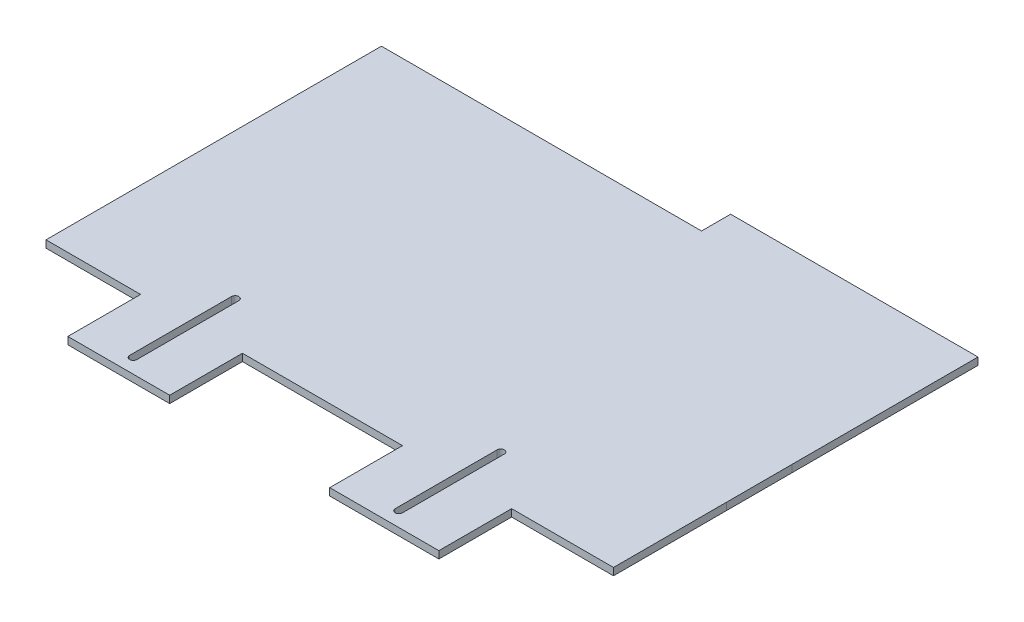
ISO-10303-21;
HEADER;
FILE_DESCRIPTION(('STEP AP214'),'2;1');
FILE_NAME('part.step','',(''),(''),'','','');
FILE_SCHEMA(('AUTOMOTIVE_DESIGN { 1 0 10303 214 1 1 1 1 }'));
ENDSEC;
DATA;
#1=APPLICATION_CONTEXT('core data for automotive mechanical design processes');
#2=APPLICATION_PROTOCOL_DEFINITION('international standard','automotive_design',2000,#1);
#3=PRODUCT_CONTEXT('',#1,'mechanical');
#4=PRODUCT('Part','Part','',(#3));
#5=PRODUCT_RELATED_PRODUCT_CATEGORY('part','',(#4));
#6=PRODUCT_DEFINITION_FORMATION('','',#4);
#7=PRODUCT_DEFINITION_CONTEXT('part definition',#1,'design');
#8=PRODUCT_DEFINITION('design','',#6,#7);
#9=PRODUCT_DEFINITION_SHAPE('','',#8);
#10=(LENGTH_UNIT() NAMED_UNIT(*) SI_UNIT(.MILLI.,.METRE.));
#11=(NAMED_UNIT(*) PLANE_ANGLE_UNIT() SI_UNIT($,.RADIAN.));
#12=(NAMED_UNIT(*) SI_UNIT($,.STERADIAN.) SOLID_ANGLE_UNIT());
#13=UNCERTAINTY_MEASURE_WITH_UNIT(LENGTH_MEASURE(1.E-05),#10,'distance_accuracy_value','');
#14=(GEOMETRIC_REPRESENTATION_CONTEXT(3) GLOBAL_UNCERTAINTY_ASSIGNED_CONTEXT((#13)) GLOBAL_UNIT_ASSIGNED_CONTEXT((#10,
#11,#12)) REPRESENTATION_CONTEXT('',''));
#15=CARTESIAN_POINT('',(0.,0.,0.));
#16=DIRECTION('',(0.,0.,1.));
#17=DIRECTION('',(1.,0.,0.));
#18=AXIS2_PLACEMENT_3D('',#15,#16,#17);
#19=CARTESIAN_POINT('',(-247.662974969548,3.175,190.824999985));
#20=DIRECTION('',(0.,0.,-1.));
#21=DIRECTION('',(-1.,0.,0.));
#22=AXIS2_PLACEMENT_3D('',#19,#20,#21);
#23=PLANE('',#22);
#24=DIRECTION('',(1.,0.,0.));
#25=VECTOR('',#24,1.);
#26=CARTESIAN_POINT('',(-247.662974969548,-3.175,190.824999985));
#27=LINE('',#26,#25);
#28=CARTESIAN_POINT('',(63.4870250304521,-3.175,190.824999985));
#29=VERTEX_POINT('',#28);
#30=CARTESIAN_POINT('',(158.737025030452,-3.175,190.824999985));
#31=VERTEX_POINT('',#30);
#32=EDGE_CURVE('E446',#29,#31,#27,.T.);
#33=ORIENTED_EDGE('',*,*,#32,.T.);
#34=DIRECTION('',(0.,1.,0.));
#35=VECTOR('',#34,1.);
#36=CARTESIAN_POINT('',(158.737025030452,-3.175,190.824999985));
#37=LINE('',#36,#35);
#38=CARTESIAN_POINT('',(158.737025030452,3.175,190.824999985));
#39=VERTEX_POINT('',#38);
#40=EDGE_CURVE('E353',#31,#39,#37,.T.);
#41=ORIENTED_EDGE('',*,*,#40,.T.);
#42=DIRECTION('',(1.,0.,0.));
#43=VECTOR('',#42,1.);
#44=CARTESIAN_POINT('',(-247.662974969548,3.175,190.824999985));
#45=LINE('',#44,#43);
#46=CARTESIAN_POINT('',(63.4870250304521,3.175,190.824999985));
#47=VERTEX_POINT('',#46);
#48=EDGE_CURVE('E433',#47,#39,#45,.T.);
#49=ORIENTED_EDGE('',*,*,#48,.F.);
#50=DIRECTION('',(0.,1.,0.));
#51=VECTOR('',#50,1.);
#52=CARTESIAN_POINT('',(63.4870250304521,-3.175,190.824999985));
#53=LINE('',#52,#51);
#54=EDGE_CURVE('E350',#29,#47,#53,.T.);
#55=ORIENTED_EDGE('',*,*,#54,.F.);
#56=EDGE_LOOP('',(#33,#41,#49,#55));
#57=FACE_BOUND('',#56,.T.);
#58=ADVANCED_FACE('F41',(#57),#23,.F.);
#59=CARTESIAN_POINT('',(0.,3.175,28.575));
#60=DIRECTION('',(0.,0.,-1.));
#61=DIRECTION('',(-1.,0.,0.));
#62=AXIS2_PLACEMENT_3D('',#59,#60,#61);
#63=PLANE('',#62);
#64=DIRECTION('',(0.,1.,0.));
#65=VECTOR('',#64,1.);
#66=CARTESIAN_POINT('',(247.637025030452,3.175,28.575));
#67=LINE('',#66,#65);
#68=CARTESIAN_POINT('',(247.637025030452,-3.175,28.575));
#69=VERTEX_POINT('',#68);
#70=CARTESIAN_POINT('',(247.637025030452,3.175,28.575));
#71=VERTEX_POINT('',#70);
#72=EDGE_CURVE('E459',#69,#71,#67,.T.);
#73=ORIENTED_EDGE('',*,*,#72,.F.);
#74=DIRECTION('',(1.,0.,0.));
#75=VECTOR('',#74,1.);
#76=CARTESIAN_POINT('',(0.,-3.175,28.575));
#77=LINE('',#76,#75);
#78=CARTESIAN_POINT('',(247.65,-3.175,28.575));
#79=VERTEX_POINT('',#78);
#80=EDGE_CURVE('E463',#69,#79,#77,.T.);
#81=ORIENTED_EDGE('',*,*,#80,.T.);
#82=DIRECTION('',(0.,-1.,0.));
#83=VECTOR('',#82,1.);
#84=CARTESIAN_POINT('',(247.65,3.175,28.575));
#85=LINE('',#84,#83);
#86=CARTESIAN_POINT('',(247.65,3.175,28.575));
#87=VERTEX_POINT('',#86);
#88=EDGE_CURVE('E11',#87,#79,#85,.T.);
#89=ORIENTED_EDGE('',*,*,#88,.F.);
#90=DIRECTION('',(1.,0.,0.));
#91=VECTOR('',#90,1.);
#92=CARTESIAN_POINT('',(0.,3.175,28.575));
#93=LINE('',#92,#91);
#94=EDGE_CURVE('E464',#71,#87,#93,.T.);
#95=ORIENTED_EDGE('',*,*,#94,.F.);
#96=EDGE_LOOP('',(#73,#81,#89,#95));
#97=FACE_BOUND('',#96,.T.);
#98=ADVANCED_FACE('F43',(#97),#63,.F.);
#99=CARTESIAN_POINT('',(0.,3.175,-28.575));
#100=DIRECTION('',(0.,0.,-1.));
#101=DIRECTION('',(-1.,0.,0.));
#102=AXIS2_PLACEMENT_3D('',#99,#100,#101);
#103=PLANE('',#102);
#104=DIRECTION('',(1.,0.,0.));
#105=VECTOR('',#104,1.);
#106=CARTESIAN_POINT('',(0.,-3.175,-28.575));
#107=LINE('',#106,#105);
#108=CARTESIAN_POINT('',(247.637025030452,-3.175,-28.575));
#109=VERTEX_POINT('',#108);
#110=CARTESIAN_POINT('',(247.65,-3.175,-28.575));
#111=VERTEX_POINT('',#110);
#112=EDGE_CURVE('E468',#109,#111,#107,.T.);
#113=ORIENTED_EDGE('',*,*,#112,.F.);
#114=DIRECTION('',(0.,1.,0.));
#115=VECTOR('',#114,1.);
#116=CARTESIAN_POINT('',(247.637025030452,3.175,-28.575));
#117=LINE('',#116,#115);
#118=CARTESIAN_POINT('',(247.637025030452,3.175,-28.575));
#119=VERTEX_POINT('',#118);
#120=EDGE_CURVE('E455',#109,#119,#117,.T.);
#121=ORIENTED_EDGE('',*,*,#120,.T.);
#122=DIRECTION('',(1.,0.,0.));
#123=VECTOR('',#122,1.);
#124=CARTESIAN_POINT('',(0.,3.175,-28.575));
#125=LINE('',#124,#123);
#126=CARTESIAN_POINT('',(247.65,3.175,-28.575));
#127=VERTEX_POINT('',#126);
#128=EDGE_CURVE('E472',#119,#127,#125,.T.);
#129=ORIENTED_EDGE('',*,*,#128,.T.);
#130=DIRECTION('',(0.,-1.,0.));
#131=VECTOR('',#130,1.);
#132=CARTESIAN_POINT('',(247.65,3.175,-28.575));
#133=LINE('',#132,#131);
#134=EDGE_CURVE('E50',#127,#111,#133,.T.);
#135=ORIENTED_EDGE('',*,*,#134,.T.);
#136=EDGE_LOOP('',(#113,#121,#129,#135));
#137=FACE_BOUND('',#136,.T.);
#138=ADVANCED_FACE('F487',(#137),#103,.T.);
#139=CARTESIAN_POINT('',(247.65,3.175,0.));
#140=DIRECTION('',(-1.,0.,0.));
#141=DIRECTION('',(0.,0.,1.));
#142=AXIS2_PLACEMENT_3D('',#139,#140,#141);
#143=PLANE('',#142);
#144=DIRECTION('',(0.,0.,-1.));
#145=VECTOR('',#144,1.);
#146=CARTESIAN_POINT('',(247.65,-3.175,0.));
#147=LINE('',#146,#145);
#148=EDGE_CURVE('E477',#79,#111,#147,.T.);
#149=ORIENTED_EDGE('',*,*,#148,.T.);
#150=ORIENTED_EDGE('',*,*,#134,.F.);
#151=DIRECTION('',(0.,0.,-1.));
#152=VECTOR('',#151,1.);
#153=CARTESIAN_POINT('',(247.65,3.175,0.));
#154=LINE('',#153,#152);
#155=EDGE_CURVE('E467',#87,#127,#154,.T.);
#156=ORIENTED_EDGE('',*,*,#155,.F.);
#157=ORIENTED_EDGE('',*,*,#88,.T.);
#158=EDGE_LOOP('',(#149,#150,#156,#157));
#159=FACE_BOUND('',#158,.T.);
#160=ADVANCED_FACE('F492',(#159),#143,.F.);
#161=CARTESIAN_POINT('',(0.,3.175,0.));
#162=DIRECTION('',(0.,1.,0.));
#163=DIRECTION('',(0.,0.,1.));
#164=AXIS2_PLACEMENT_3D('',#161,#162,#163);
#165=PLANE('',#164);
#166=DIRECTION('',(0.,0.,-1.));
#167=VECTOR('',#166,1.);
#168=CARTESIAN_POINT('',(31.7370250304521,3.175,-165.424999985));
#169=LINE('',#168,#167);
#170=CARTESIAN_POINT('',(31.7370250304521,3.175,-165.424999985));
#171=VERTEX_POINT('',#170);
#172=CARTESIAN_POINT('',(31.7370250304521,3.175,-190.824999985));
#173=VERTEX_POINT('',#172);
#174=EDGE_CURVE('E238',#171,#173,#169,.T.);
#175=ORIENTED_EDGE('',*,*,#174,.F.);
#176=DIRECTION('',(1.,0.,0.));
#177=VECTOR('',#176,1.);
#178=CARTESIAN_POINT('',(31.7370250304521,3.175,-165.424999985));
#179=LINE('',#178,#177);
#180=CARTESIAN_POINT('',(-247.662974969548,3.175,-165.424999985));
#181=VERTEX_POINT('',#180);
#182=EDGE_CURVE('E217',#181,#171,#179,.T.);
#183=ORIENTED_EDGE('',*,*,#182,.F.);
#184=DIRECTION('',(0.,0.,1.));
#185=VECTOR('',#184,1.);
#186=CARTESIAN_POINT('',(-247.662974969548,3.175,190.824999985));
#187=LINE('',#186,#185);
#188=CARTESIAN_POINT('',(-247.662974969548,3.175,127.324999985));
#189=VERTEX_POINT('',#188);
#190=EDGE_CURVE('E430',#181,#189,#187,.T.);
#191=ORIENTED_EDGE('',*,*,#190,.T.);
#192=DIRECTION('',(-1.,0.,0.));
#193=VECTOR('',#192,1.);
#194=CARTESIAN_POINT('',(-165.112974969548,3.175,127.324999985));
#195=LINE('',#194,#193);
#196=CARTESIAN_POINT('',(-165.112974969548,3.175,127.324999985));
#197=VERTEX_POINT('',#196);
#198=EDGE_CURVE('E404',#197,#189,#195,.T.);
#199=ORIENTED_EDGE('',*,*,#198,.F.);
#200=DIRECTION('',(0.,0.,-1.));
#201=VECTOR('',#200,1.);
#202=CARTESIAN_POINT('',(-165.112974969548,3.175,127.324999985));
#203=LINE('',#202,#201);
#204=CARTESIAN_POINT('',(-165.112974969548,3.175,190.824999985));
#205=VERTEX_POINT('',#204);
#206=EDGE_CURVE('E285',#205,#197,#203,.T.);
#207=ORIENTED_EDGE('',*,*,#206,.F.);
#208=CARTESIAN_POINT('',(-76.2129749695479,3.175,190.824999985));
#209=VERTEX_POINT('',#208);
#210=EDGE_CURVE('E437',#205,#209,#45,.T.);
#211=ORIENTED_EDGE('',*,*,#210,.T.);
#212=DIRECTION('',(0.,0.,1.));
#213=VECTOR('',#212,1.);
#214=CARTESIAN_POINT('',(-76.2129749695479,3.175,190.824999985));
#215=LINE('',#214,#213);
#216=CARTESIAN_POINT('',(-76.2129749695479,3.175,127.324999985));
#217=VERTEX_POINT('',#216);
#218=EDGE_CURVE('E368',#217,#209,#215,.T.);
#219=ORIENTED_EDGE('',*,*,#218,.F.);
#220=DIRECTION('',(-1.,0.,0.));
#221=VECTOR('',#220,1.);
#222=CARTESIAN_POINT('',(-76.2129749695479,3.175,127.324999985));
#223=LINE('',#222,#221);
#224=CARTESIAN_POINT('',(63.4870250304521,3.175,127.324999985));
#225=VERTEX_POINT('',#224);
#226=EDGE_CURVE('E381',#225,#217,#223,.T.);
#227=ORIENTED_EDGE('',*,*,#226,.F.);
#228=DIRECTION('',(0.,0.,-1.));
#229=VECTOR('',#228,1.);
#230=CARTESIAN_POINT('',(63.4870250304521,3.175,190.824999985));
#231=LINE('',#230,#229);
#232=EDGE_CURVE('E377',#47,#225,#231,.T.);
#233=ORIENTED_EDGE('',*,*,#232,.F.);
#234=ORIENTED_EDGE('',*,*,#48,.T.);
#235=DIRECTION('',(0.,0.,1.));
#236=VECTOR('',#235,1.);
#237=CARTESIAN_POINT('',(158.737025030452,3.175,127.324999985));
#238=LINE('',#237,#236);
#239=CARTESIAN_POINT('',(158.737025030452,3.175,127.324999985));
#240=VERTEX_POINT('',#239);
#241=EDGE_CURVE('E341',#240,#39,#238,.T.);
#242=ORIENTED_EDGE('',*,*,#241,.F.);
#243=DIRECTION('',(-1.,0.,0.));
#244=VECTOR('',#243,1.);
#245=CARTESIAN_POINT('',(158.737025030452,3.175,127.324999985));
#246=LINE('',#245,#244);
#247=CARTESIAN_POINT('',(247.637025030452,3.175,127.324999985));
#248=VERTEX_POINT('',#247);
#249=EDGE_CURVE('E346',#248,#240,#246,.T.);
#250=ORIENTED_EDGE('',*,*,#249,.F.);
#251=DIRECTION('',(0.,0.,-1.));
#252=VECTOR('',#251,1.);
#253=CARTESIAN_POINT('',(247.637025030452,3.175,190.824999985));
#254=LINE('',#253,#252);
#255=EDGE_CURVE('E422',#248,#71,#254,.T.);
#256=ORIENTED_EDGE('',*,*,#255,.T.);
#257=ORIENTED_EDGE('',*,*,#94,.T.);
#258=ORIENTED_EDGE('',*,*,#155,.T.);
#259=ORIENTED_EDGE('',*,*,#128,.F.);
#260=CARTESIAN_POINT('',(247.637025030452,3.175,-190.824999985));
#261=VERTEX_POINT('',#260);
#262=EDGE_CURVE('E426',#119,#261,#254,.T.);
#263=ORIENTED_EDGE('',*,*,#262,.T.);
#264=DIRECTION('',(-1.,0.,0.));
#265=VECTOR('',#264,1.);
#266=CARTESIAN_POINT('',(-247.662974969548,3.175,-190.824999985));
#267=LINE('',#266,#265);
#268=EDGE_CURVE('E425',#261,#173,#267,.T.);
#269=ORIENTED_EDGE('',*,*,#268,.T.);
#270=EDGE_LOOP('',(#175,#183,#191,#199,#207,#211,#219,#227,#233,#234,#242,#250,#256,#257,#258,
#259,#263,#269));
#271=FACE_BOUND('',#270,.T.);
#272=CARTESIAN_POINT('',(111.112025030452,3.175,89.2249999850001));
#273=DIRECTION('',(0.,1.,0.));
#274=DIRECTION('',(0.,0.,1.));
#275=AXIS2_PLACEMENT_3D('',#272,#273,#274);
#276=CIRCLE('',#275,3.175);
#277=CARTESIAN_POINT('',(114.287025030452,3.175,89.2249999850001));
#278=VERTEX_POINT('',#277);
#279=CARTESIAN_POINT('',(107.937025030452,3.175,89.2249999850001));
#280=VERTEX_POINT('',#279);
#281=EDGE_CURVE('E65',#278,#280,#276,.T.);
#282=ORIENTED_EDGE('',*,*,#281,.F.);
#283=DIRECTION('',(0.,0.,-1.));
#284=VECTOR('',#283,1.);
#285=CARTESIAN_POINT('',(114.287025030452,3.175,89.2249999850001));
#286=LINE('',#285,#284);
#287=CARTESIAN_POINT('',(114.287025030452,3.175,178.124999985));
#288=VERTEX_POINT('',#287);
#289=EDGE_CURVE('E255',#288,#278,#286,.T.);
#290=ORIENTED_EDGE('',*,*,#289,.F.);
#291=CARTESIAN_POINT('',(111.112025030452,3.175,178.124999985));
#292=DIRECTION('',(0.,1.,0.));
#293=DIRECTION('',(0.,0.,1.));
#294=AXIS2_PLACEMENT_3D('',#291,#292,#293);
#295=CIRCLE('',#294,3.175);
#296=CARTESIAN_POINT('',(107.937025030452,3.175,178.124999985));
#297=VERTEX_POINT('',#296);
#298=EDGE_CURVE('E275',#297,#288,#295,.T.);
#299=ORIENTED_EDGE('',*,*,#298,.F.);
#300=DIRECTION('',(0.,0.,1.));
#301=VECTOR('',#300,1.);
#302=CARTESIAN_POINT('',(107.937025030452,3.175,89.2249999850001));
#303=LINE('',#302,#301);
#304=EDGE_CURVE('E270',#280,#297,#303,.T.);
#305=ORIENTED_EDGE('',*,*,#304,.F.);
#306=EDGE_LOOP('',(#282,#290,#299,#305));
#307=FACE_BOUND('',#306,.T.);
#308=CARTESIAN_POINT('',(-120.662974969548,3.175,89.2249999850001));
#309=DIRECTION('',(0.,1.,0.));
#310=DIRECTION('',(0.,0.,1.));
#311=AXIS2_PLACEMENT_3D('',#308,#309,#310);
#312=CIRCLE('',#311,3.17499999999998);
#313=CARTESIAN_POINT('',(-117.487974969548,3.175,89.2249999850001));
#314=VERTEX_POINT('',#313);
#315=CARTESIAN_POINT('',(-123.837974969548,3.175,89.2249999850001));
#316=VERTEX_POINT('',#315);
#317=EDGE_CURVE('E246',#314,#316,#312,.T.);
#318=ORIENTED_EDGE('',*,*,#317,.F.);
#319=DIRECTION('',(0.,0.,-1.));
#320=VECTOR('',#319,1.);
#321=CARTESIAN_POINT('',(-117.487974969548,3.175,89.2249999850001));
#322=LINE('',#321,#320);
#323=CARTESIAN_POINT('',(-117.487974969548,3.175,178.124999985));
#324=VERTEX_POINT('',#323);
#325=EDGE_CURVE('E299',#324,#314,#322,.T.);
#326=ORIENTED_EDGE('',*,*,#325,.F.);
#327=CARTESIAN_POINT('',(-120.662974969548,3.175,178.124999985));
#328=DIRECTION('',(0.,1.,0.));
#329=DIRECTION('',(0.,0.,1.));
#330=AXIS2_PLACEMENT_3D('',#327,#328,#329);
#331=CIRCLE('',#330,3.17500000000001);
#332=CARTESIAN_POINT('',(-123.837974969548,3.175,178.124999985));
#333=VERTEX_POINT('',#332);
#334=EDGE_CURVE('E318',#333,#324,#331,.T.);
#335=ORIENTED_EDGE('',*,*,#334,.F.);
#336=DIRECTION('',(0.,0.,1.));
#337=VECTOR('',#336,1.);
#338=CARTESIAN_POINT('',(-123.837974969548,3.175,89.2249999850001));
#339=LINE('',#338,#337);
#340=EDGE_CURVE('E314',#316,#333,#339,.T.);
#341=ORIENTED_EDGE('',*,*,#340,.F.);
#342=EDGE_LOOP('',(#318,#326,#335,#341));
#343=FACE_BOUND('',#342,.T.);
#344=ADVANCED_FACE('F509',(#271,#307,#343),#165,.T.);
#345=CARTESIAN_POINT('',(0.,-3.175,0.));
#346=DIRECTION('',(0.,1.,0.));
#347=DIRECTION('',(0.,0.,1.));
#348=AXIS2_PLACEMENT_3D('',#345,#346,#347);
#349=PLANE('',#348);
#350=DIRECTION('',(0.,0.,-1.));
#351=VECTOR('',#350,1.);
#352=CARTESIAN_POINT('',(114.287025030452,-3.175,89.2249999850001));
#353=LINE('',#352,#351);
#354=CARTESIAN_POINT('',(114.287025030452,-3.175,178.124999985));
#355=VERTEX_POINT('',#354);
#356=CARTESIAN_POINT('',(114.287025030452,-3.175,89.2249999850001));
#357=VERTEX_POINT('',#356);
#358=EDGE_CURVE('E263',#355,#357,#353,.T.);
#359=ORIENTED_EDGE('',*,*,#358,.T.);
#360=CARTESIAN_POINT('',(111.112025030452,-3.175,89.2249999850001));
#361=DIRECTION('',(0.,1.,0.));
#362=DIRECTION('',(0.,0.,1.));
#363=AXIS2_PLACEMENT_3D('',#360,#361,#362);
#364=CIRCLE('',#363,3.175);
#365=CARTESIAN_POINT('',(107.937025030452,-3.175,89.2249999850001));
#366=VERTEX_POINT('',#365);
#367=EDGE_CURVE('E250',#357,#366,#364,.T.);
#368=ORIENTED_EDGE('',*,*,#367,.T.);
#369=DIRECTION('',(0.,0.,1.));
#370=VECTOR('',#369,1.);
#371=CARTESIAN_POINT('',(107.937025030452,-3.175,89.2249999850001));
#372=LINE('',#371,#370);
#373=CARTESIAN_POINT('',(107.937025030452,-3.175,178.124999985));
#374=VERTEX_POINT('',#373);
#375=EDGE_CURVE('E254',#366,#374,#372,.T.);
#376=ORIENTED_EDGE('',*,*,#375,.T.);
#377=CARTESIAN_POINT('',(111.112025030452,-3.175,178.124999985));
#378=DIRECTION('',(0.,1.,0.));
#379=DIRECTION('',(0.,0.,1.));
#380=AXIS2_PLACEMENT_3D('',#377,#378,#379);
#381=CIRCLE('',#380,3.175);
#382=EDGE_CURVE('E259',#374,#355,#381,.T.);
#383=ORIENTED_EDGE('',*,*,#382,.T.);
#384=EDGE_LOOP('',(#359,#368,#376,#383));
#385=FACE_BOUND('',#384,.T.);
#386=DIRECTION('',(0.,0.,-1.));
#387=VECTOR('',#386,1.);
#388=CARTESIAN_POINT('',(-117.487974969548,-3.175,89.2249999850001));
#389=LINE('',#388,#387);
#390=CARTESIAN_POINT('',(-117.487974969548,-3.175,178.124999985));
#391=VERTEX_POINT('',#390);
#392=CARTESIAN_POINT('',(-117.487974969548,-3.175,89.2249999850001));
#393=VERTEX_POINT('',#392);
#394=EDGE_CURVE('E307',#391,#393,#389,.T.);
#395=ORIENTED_EDGE('',*,*,#394,.T.);
#396=CARTESIAN_POINT('',(-120.662974969548,-3.175,89.2249999850001));
#397=DIRECTION('',(0.,1.,0.));
#398=DIRECTION('',(0.,0.,1.));
#399=AXIS2_PLACEMENT_3D('',#396,#397,#398);
#400=CIRCLE('',#399,3.17499999999998);
#401=CARTESIAN_POINT('',(-123.837974969548,-3.175,89.2249999850001));
#402=VERTEX_POINT('',#401);
#403=EDGE_CURVE('E294',#393,#402,#400,.T.);
#404=ORIENTED_EDGE('',*,*,#403,.T.);
#405=DIRECTION('',(0.,0.,1.));
#406=VECTOR('',#405,1.);
#407=CARTESIAN_POINT('',(-123.837974969548,-3.175,89.2249999850001));
#408=LINE('',#407,#406);
#409=CARTESIAN_POINT('',(-123.837974969548,-3.175,178.124999985));
#410=VERTEX_POINT('',#409);
#411=EDGE_CURVE('E298',#402,#410,#408,.T.);
#412=ORIENTED_EDGE('',*,*,#411,.T.);
#413=CARTESIAN_POINT('',(-120.662974969548,-3.175,178.124999985));
#414=DIRECTION('',(0.,1.,0.));
#415=DIRECTION('',(0.,0.,1.));
#416=AXIS2_PLACEMENT_3D('',#413,#414,#415);
#417=CIRCLE('',#416,3.17500000000001);
#418=EDGE_CURVE('E303',#410,#391,#417,.T.);
#419=ORIENTED_EDGE('',*,*,#418,.T.);
#420=EDGE_LOOP('',(#395,#404,#412,#419));
#421=FACE_BOUND('',#420,.T.);
#422=DIRECTION('',(1.,0.,0.));
#423=VECTOR('',#422,1.);
#424=CARTESIAN_POINT('',(31.7370250304521,-3.175,-165.424999985));
#425=LINE('',#424,#423);
#426=CARTESIAN_POINT('',(-247.662974969548,-3.175,-165.424999985));
#427=VERTEX_POINT('',#426);
#428=CARTESIAN_POINT('',(31.7370250304521,-3.175,-165.424999985));
#429=VERTEX_POINT('',#428);
#430=EDGE_CURVE('E57',#427,#429,#425,.T.);
#431=ORIENTED_EDGE('',*,*,#430,.T.);
#432=DIRECTION('',(0.,0.,-1.));
#433=VECTOR('',#432,1.);
#434=CARTESIAN_POINT('',(31.7370250304521,-3.175,-165.424999985));
#435=LINE('',#434,#433);
#436=CARTESIAN_POINT('',(31.7370250304521,-3.175,-190.824999985));
#437=VERTEX_POINT('',#436);
#438=EDGE_CURVE('E225',#429,#437,#435,.T.);
#439=ORIENTED_EDGE('',*,*,#438,.T.);
#440=DIRECTION('',(-1.,0.,0.));
#441=VECTOR('',#440,1.);
#442=CARTESIAN_POINT('',(-247.662974969548,-3.175,-190.824999985));
#443=LINE('',#442,#441);
#444=CARTESIAN_POINT('',(247.637025030452,-3.175,-190.824999985));
#445=VERTEX_POINT('',#444);
#446=EDGE_CURVE('E441',#445,#437,#443,.T.);
#447=ORIENTED_EDGE('',*,*,#446,.F.);
#448=DIRECTION('',(0.,0.,-1.));
#449=VECTOR('',#448,1.);
#450=CARTESIAN_POINT('',(247.637025030452,-3.175,190.824999985));
#451=LINE('',#450,#449);
#452=EDGE_CURVE('E357',#109,#445,#451,.T.);
#453=ORIENTED_EDGE('',*,*,#452,.F.);
#454=ORIENTED_EDGE('',*,*,#112,.T.);
#455=ORIENTED_EDGE('',*,*,#148,.F.);
#456=ORIENTED_EDGE('',*,*,#80,.F.);
#457=CARTESIAN_POINT('',(247.637025030452,-3.175,127.324999985));
#458=VERTEX_POINT('',#457);
#459=EDGE_CURVE('E438',#458,#69,#451,.T.);
#460=ORIENTED_EDGE('',*,*,#459,.F.);
#461=DIRECTION('',(-1.,0.,0.));
#462=VECTOR('',#461,1.);
#463=CARTESIAN_POINT('',(158.737025030452,-3.175,127.324999985));
#464=LINE('',#463,#462);
#465=CARTESIAN_POINT('',(158.737025030452,-3.175,127.324999985));
#466=VERTEX_POINT('',#465);
#467=EDGE_CURVE('E336',#458,#466,#464,.T.);
#468=ORIENTED_EDGE('',*,*,#467,.T.);
#469=DIRECTION('',(0.,0.,1.));
#470=VECTOR('',#469,1.);
#471=CARTESIAN_POINT('',(158.737025030452,-3.175,127.324999985));
#472=LINE('',#471,#470);
#473=EDGE_CURVE('E340',#466,#31,#472,.T.);
#474=ORIENTED_EDGE('',*,*,#473,.T.);
#475=ORIENTED_EDGE('',*,*,#32,.F.);
#476=DIRECTION('',(0.,0.,-1.));
#477=VECTOR('',#476,1.);
#478=CARTESIAN_POINT('',(63.4870250304521,-3.175,190.824999985));
#479=LINE('',#478,#477);
#480=CARTESIAN_POINT('',(63.4870250304521,-3.175,127.324999985));
#481=VERTEX_POINT('',#480);
#482=EDGE_CURVE('E363',#29,#481,#479,.T.);
#483=ORIENTED_EDGE('',*,*,#482,.T.);
#484=DIRECTION('',(-1.,0.,0.));
#485=VECTOR('',#484,1.);
#486=CARTESIAN_POINT('',(-76.2129749695479,-3.175,127.324999985));
#487=LINE('',#486,#485);
#488=CARTESIAN_POINT('',(-76.2129749695479,-3.175,127.324999985));
#489=VERTEX_POINT('',#488);
#490=EDGE_CURVE('E367',#481,#489,#487,.T.);
#491=ORIENTED_EDGE('',*,*,#490,.T.);
#492=DIRECTION('',(0.,0.,1.));
#493=VECTOR('',#492,1.);
#494=CARTESIAN_POINT('',(-76.2129749695479,-3.175,190.824999985));
#495=LINE('',#494,#493);
#496=CARTESIAN_POINT('',(-76.2129749695479,-3.175,190.824999985));
#497=VERTEX_POINT('',#496);
#498=EDGE_CURVE('E372',#489,#497,#495,.T.);
#499=ORIENTED_EDGE('',*,*,#498,.T.);
#500=CARTESIAN_POINT('',(-165.112974969548,-3.175,190.824999985));
#501=VERTEX_POINT('',#500);
#502=EDGE_CURVE('E450',#501,#497,#27,.T.);
#503=ORIENTED_EDGE('',*,*,#502,.F.);
#504=DIRECTION('',(0.,0.,-1.));
#505=VECTOR('',#504,1.);
#506=CARTESIAN_POINT('',(-165.112974969548,-3.175,127.324999985));
#507=LINE('',#506,#505);
#508=CARTESIAN_POINT('',(-165.112974969548,-3.175,127.324999985));
#509=VERTEX_POINT('',#508);
#510=EDGE_CURVE('E399',#501,#509,#507,.T.);
#511=ORIENTED_EDGE('',*,*,#510,.T.);
#512=DIRECTION('',(-1.,0.,0.));
#513=VECTOR('',#512,1.);
#514=CARTESIAN_POINT('',(-165.112974969548,-3.175,127.324999985));
#515=LINE('',#514,#513);
#516=CARTESIAN_POINT('',(-247.662974969548,-3.175,127.324999985));
#517=VERTEX_POINT('',#516);
#518=EDGE_CURVE('E403',#509,#517,#515,.T.);
#519=ORIENTED_EDGE('',*,*,#518,.T.);
#520=DIRECTION('',(0.,0.,1.));
#521=VECTOR('',#520,1.);
#522=CARTESIAN_POINT('',(-247.662974969548,-3.175,190.824999985));
#523=LINE('',#522,#521);
#524=EDGE_CURVE('E236',#427,#517,#523,.T.);
#525=ORIENTED_EDGE('',*,*,#524,.F.);
#526=EDGE_LOOP('',(#431,#439,#447,#453,#454,#455,#456,#460,#468,#474,#475,#483,#491,#499,#503,
#511,#519,#525));
#527=FACE_BOUND('',#526,.T.);
#528=ADVANCED_FACE('F234',(#385,#421,#527),#349,.F.);
#529=CARTESIAN_POINT('',(247.637025030452,3.175,190.824999985));
#530=DIRECTION('',(-1.,0.,0.));
#531=DIRECTION('',(0.,0.,1.));
#532=AXIS2_PLACEMENT_3D('',#529,#530,#531);
#533=PLANE('',#532);
#534=ORIENTED_EDGE('',*,*,#255,.F.);
#535=DIRECTION('',(0.,1.,0.));
#536=VECTOR('',#535,1.);
#537=CARTESIAN_POINT('',(247.637025030452,-3.175,127.324999985));
#538=LINE('',#537,#536);
#539=EDGE_CURVE('E345',#458,#248,#538,.T.);
#540=ORIENTED_EDGE('',*,*,#539,.F.);
#541=ORIENTED_EDGE('',*,*,#459,.T.);
#542=ORIENTED_EDGE('',*,*,#72,.T.);
#543=EDGE_LOOP('',(#534,#540,#541,#542));
#544=FACE_BOUND('',#543,.T.);
#545=ADVANCED_FACE('F539',(#544),#533,.F.);
#546=ORIENTED_EDGE('',*,*,#120,.F.);
#547=ORIENTED_EDGE('',*,*,#452,.T.);
#548=DIRECTION('',(0.,-1.,0.));
#549=VECTOR('',#548,1.);
#550=CARTESIAN_POINT('',(247.637025030452,3.175,-190.824999985));
#551=LINE('',#550,#549);
#552=EDGE_CURVE('E451',#261,#445,#551,.T.);
#553=ORIENTED_EDGE('',*,*,#552,.F.);
#554=ORIENTED_EDGE('',*,*,#262,.F.);
#555=EDGE_LOOP('',(#546,#547,#553,#554));
#556=FACE_BOUND('',#555,.T.);
#557=ADVANCED_FACE('F570',(#556),#533,.F.);
#558=CARTESIAN_POINT('',(-247.662974969548,3.175,-190.824999985));
#559=DIRECTION('',(0.,0.,1.));
#560=DIRECTION('',(1.,0.,0.));
#561=AXIS2_PLACEMENT_3D('',#558,#559,#560);
#562=PLANE('',#561);
#563=ORIENTED_EDGE('',*,*,#446,.T.);
#564=DIRECTION('',(0.,1.,0.));
#565=VECTOR('',#564,1.);
#566=CARTESIAN_POINT('',(31.7370250304521,-3.175,-190.824999985));
#567=LINE('',#566,#565);
#568=EDGE_CURVE('E221',#437,#173,#567,.T.);
#569=ORIENTED_EDGE('',*,*,#568,.T.);
#570=ORIENTED_EDGE('',*,*,#268,.F.);
#571=ORIENTED_EDGE('',*,*,#552,.T.);
#572=EDGE_LOOP('',(#563,#569,#570,#571));
#573=FACE_BOUND('',#572,.T.);
#574=ADVANCED_FACE('F565',(#573),#562,.F.);
#575=CARTESIAN_POINT('',(-247.662974969548,3.175,190.824999985));
#576=DIRECTION('',(1.,0.,0.));
#577=DIRECTION('',(0.,0.,-1.));
#578=AXIS2_PLACEMENT_3D('',#575,#576,#577);
#579=PLANE('',#578);
#580=ORIENTED_EDGE('',*,*,#190,.F.);
#581=DIRECTION('',(0.,1.,0.));
#582=VECTOR('',#581,1.);
#583=CARTESIAN_POINT('',(-247.662974969548,-3.175,-165.424999985));
#584=LINE('',#583,#582);
#585=EDGE_CURVE('E222',#427,#181,#584,.T.);
#586=ORIENTED_EDGE('',*,*,#585,.F.);
#587=ORIENTED_EDGE('',*,*,#524,.T.);
#588=DIRECTION('',(0.,1.,0.));
#589=VECTOR('',#588,1.);
#590=CARTESIAN_POINT('',(-247.662974969548,-3.175,127.324999985));
#591=LINE('',#590,#589);
#592=EDGE_CURVE('E382',#517,#189,#591,.T.);
#593=ORIENTED_EDGE('',*,*,#592,.T.);
#594=EDGE_LOOP('',(#580,#586,#587,#593));
#595=FACE_BOUND('',#594,.T.);
#596=ADVANCED_FACE('F556',(#595),#579,.F.);
#597=ORIENTED_EDGE('',*,*,#502,.T.);
#598=DIRECTION('',(0.,1.,0.));
#599=VECTOR('',#598,1.);
#600=CARTESIAN_POINT('',(-76.2129749695479,-3.175,190.824999985));
#601=LINE('',#600,#599);
#602=EDGE_CURVE('E390',#497,#209,#601,.T.);
#603=ORIENTED_EDGE('',*,*,#602,.T.);
#604=ORIENTED_EDGE('',*,*,#210,.F.);
#605=DIRECTION('',(0.,1.,0.));
#606=VECTOR('',#605,1.);
#607=CARTESIAN_POINT('',(-165.112974969548,-3.175,190.824999985));
#608=LINE('',#607,#606);
#609=EDGE_CURVE('E407',#501,#205,#608,.T.);
#610=ORIENTED_EDGE('',*,*,#609,.F.);
#611=EDGE_LOOP('',(#597,#603,#604,#610));
#612=FACE_BOUND('',#611,.T.);
#613=ADVANCED_FACE('F515',(#612),#23,.F.);
#614=CARTESIAN_POINT('',(-165.112974969548,-3.175,127.324999985));
#615=DIRECTION('',(0.,0.,-1.));
#616=DIRECTION('',(-1.,0.,0.));
#617=AXIS2_PLACEMENT_3D('',#614,#615,#616);
#618=PLANE('',#617);
#619=ORIENTED_EDGE('',*,*,#198,.T.);
#620=ORIENTED_EDGE('',*,*,#592,.F.);
#621=ORIENTED_EDGE('',*,*,#518,.F.);
#622=DIRECTION('',(0.,1.,0.));
#623=VECTOR('',#622,1.);
#624=CARTESIAN_POINT('',(-165.112974969548,-3.175,127.324999985));
#625=LINE('',#624,#623);
#626=EDGE_CURVE('E417',#509,#197,#625,.T.);
#627=ORIENTED_EDGE('',*,*,#626,.T.);
#628=EDGE_LOOP('',(#619,#620,#621,#627));
#629=FACE_BOUND('',#628,.T.);
#630=ADVANCED_FACE('F555',(#629),#618,.F.);
#631=CARTESIAN_POINT('',(-165.112974969548,-3.175,127.324999985));
#632=DIRECTION('',(1.,0.,0.));
#633=DIRECTION('',(0.,0.,-1.));
#634=AXIS2_PLACEMENT_3D('',#631,#632,#633);
#635=PLANE('',#634);
#636=ORIENTED_EDGE('',*,*,#206,.T.);
#637=ORIENTED_EDGE('',*,*,#626,.F.);
#638=ORIENTED_EDGE('',*,*,#510,.F.);
#639=ORIENTED_EDGE('',*,*,#609,.T.);
#640=EDGE_LOOP('',(#636,#637,#638,#639));
#641=FACE_BOUND('',#640,.T.);
#642=ADVANCED_FACE('F561',(#641),#635,.F.);
#643=CARTESIAN_POINT('',(63.4870250304521,-3.175,190.824999985));
#644=DIRECTION('',(1.,0.,0.));
#645=DIRECTION('',(0.,0.,-1.));
#646=AXIS2_PLACEMENT_3D('',#643,#644,#645);
#647=PLANE('',#646);
#648=ORIENTED_EDGE('',*,*,#232,.T.);
#649=DIRECTION('',(0.,1.,0.));
#650=VECTOR('',#649,1.);
#651=CARTESIAN_POINT('',(63.4870250304521,-3.175,127.324999985));
#652=LINE('',#651,#650);
#653=EDGE_CURVE('E376',#481,#225,#652,.T.);
#654=ORIENTED_EDGE('',*,*,#653,.F.);
#655=ORIENTED_EDGE('',*,*,#482,.F.);
#656=ORIENTED_EDGE('',*,*,#54,.T.);
#657=EDGE_LOOP('',(#648,#654,#655,#656));
#658=FACE_BOUND('',#657,.T.);
#659=ADVANCED_FACE('F642',(#658),#647,.F.);
#660=CARTESIAN_POINT('',(-76.2129749695479,-3.175,190.824999985));
#661=DIRECTION('',(-1.,0.,0.));
#662=DIRECTION('',(0.,0.,1.));
#663=AXIS2_PLACEMENT_3D('',#660,#661,#662);
#664=PLANE('',#663);
#665=ORIENTED_EDGE('',*,*,#218,.T.);
#666=ORIENTED_EDGE('',*,*,#602,.F.);
#667=ORIENTED_EDGE('',*,*,#498,.F.);
#668=DIRECTION('',(0.,1.,0.));
#669=VECTOR('',#668,1.);
#670=CARTESIAN_POINT('',(-76.2129749695479,-3.175,127.324999985));
#671=LINE('',#670,#669);
#672=EDGE_CURVE('E394',#489,#217,#671,.T.);
#673=ORIENTED_EDGE('',*,*,#672,.T.);
#674=EDGE_LOOP('',(#665,#666,#667,#673));
#675=FACE_BOUND('',#674,.T.);
#676=ADVANCED_FACE('F519',(#675),#664,.F.);
#677=CARTESIAN_POINT('',(-76.2129749695479,-3.175,127.324999985));
#678=DIRECTION('',(0.,0.,-1.));
#679=DIRECTION('',(-1.,0.,0.));
#680=AXIS2_PLACEMENT_3D('',#677,#678,#679);
#681=PLANE('',#680);
#682=ORIENTED_EDGE('',*,*,#226,.T.);
#683=ORIENTED_EDGE('',*,*,#672,.F.);
#684=ORIENTED_EDGE('',*,*,#490,.F.);
#685=ORIENTED_EDGE('',*,*,#653,.T.);
#686=EDGE_LOOP('',(#682,#683,#684,#685));
#687=FACE_BOUND('',#686,.T.);
#688=ADVANCED_FACE('F523',(#687),#681,.F.);
#689=CARTESIAN_POINT('',(158.737025030452,-3.175,127.324999985));
#690=DIRECTION('',(-1.,0.,0.));
#691=DIRECTION('',(0.,0.,1.));
#692=AXIS2_PLACEMENT_3D('',#689,#690,#691);
#693=PLANE('',#692);
#694=ORIENTED_EDGE('',*,*,#241,.T.);
#695=ORIENTED_EDGE('',*,*,#40,.F.);
#696=ORIENTED_EDGE('',*,*,#473,.F.);
#697=DIRECTION('',(0.,1.,0.));
#698=VECTOR('',#697,1.);
#699=CARTESIAN_POINT('',(158.737025030452,-3.175,127.324999985));
#700=LINE('',#699,#698);
#701=EDGE_CURVE('E358',#466,#240,#700,.T.);
#702=ORIENTED_EDGE('',*,*,#701,.T.);
#703=EDGE_LOOP('',(#694,#695,#696,#702));
#704=FACE_BOUND('',#703,.T.);
#705=ADVANCED_FACE('F532',(#704),#693,.F.);
#706=CARTESIAN_POINT('',(158.737025030452,-3.175,127.324999985));
#707=DIRECTION('',(0.,0.,-1.));
#708=DIRECTION('',(-1.,0.,0.));
#709=AXIS2_PLACEMENT_3D('',#706,#707,#708);
#710=PLANE('',#709);
#711=ORIENTED_EDGE('',*,*,#249,.T.);
#712=ORIENTED_EDGE('',*,*,#701,.F.);
#713=ORIENTED_EDGE('',*,*,#467,.F.);
#714=ORIENTED_EDGE('',*,*,#539,.T.);
#715=EDGE_LOOP('',(#711,#712,#713,#714));
#716=FACE_BOUND('',#715,.T.);
#717=ADVANCED_FACE('F535',(#716),#710,.F.);
#718=CARTESIAN_POINT('',(-120.662974969548,-3.175,89.2249999850001));
#719=DIRECTION('',(0.,1.,0.));
#720=DIRECTION('',(0.,0.,1.));
#721=AXIS2_PLACEMENT_3D('',#718,#719,#720);
#722=CYLINDRICAL_SURFACE('',#721,3.17499999999998);
#723=ORIENTED_EDGE('',*,*,#317,.T.);
#724=DIRECTION('',(0.,1.,0.));
#725=VECTOR('',#724,1.);
#726=CARTESIAN_POINT('',(-123.837974969548,-3.175,89.2249999850001));
#727=LINE('',#726,#725);
#728=EDGE_CURVE('E311',#402,#316,#727,.T.);
#729=ORIENTED_EDGE('',*,*,#728,.F.);
#730=ORIENTED_EDGE('',*,*,#403,.F.);
#731=DIRECTION('',(0.,1.,0.));
#732=VECTOR('',#731,1.);
#733=CARTESIAN_POINT('',(-117.487974969548,-3.175,89.2249999850001));
#734=LINE('',#733,#732);
#735=EDGE_CURVE('E271',#393,#314,#734,.T.);
#736=ORIENTED_EDGE('',*,*,#735,.T.);
#737=EDGE_LOOP('',(#723,#729,#730,#736));
#738=FACE_BOUND('',#737,.T.);
#739=ADVANCED_FACE('F678',(#738),#722,.F.);
#740=CARTESIAN_POINT('',(-117.487974969548,-3.175,89.2249999850001));
#741=DIRECTION('',(1.,0.,0.));
#742=DIRECTION('',(0.,0.,-1.));
#743=AXIS2_PLACEMENT_3D('',#740,#741,#742);
#744=PLANE('',#743);
#745=ORIENTED_EDGE('',*,*,#325,.T.);
#746=ORIENTED_EDGE('',*,*,#735,.F.);
#747=ORIENTED_EDGE('',*,*,#394,.F.);
#748=DIRECTION('',(0.,1.,0.));
#749=VECTOR('',#748,1.);
#750=CARTESIAN_POINT('',(-117.487974969548,-3.175,178.124999985));
#751=LINE('',#750,#749);
#752=EDGE_CURVE('E327',#391,#324,#751,.T.);
#753=ORIENTED_EDGE('',*,*,#752,.T.);
#754=EDGE_LOOP('',(#745,#746,#747,#753));
#755=FACE_BOUND('',#754,.T.);
#756=ADVANCED_FACE('F686',(#755),#744,.F.);
#757=CARTESIAN_POINT('',(-120.662974969548,-3.175,178.124999985));
#758=DIRECTION('',(0.,1.,0.));
#759=DIRECTION('',(0.,0.,1.));
#760=AXIS2_PLACEMENT_3D('',#757,#758,#759);
#761=CYLINDRICAL_SURFACE('',#760,3.17500000000001);
#762=ORIENTED_EDGE('',*,*,#334,.T.);
#763=ORIENTED_EDGE('',*,*,#752,.F.);
#764=ORIENTED_EDGE('',*,*,#418,.F.);
#765=DIRECTION('',(0.,1.,0.));
#766=VECTOR('',#765,1.);
#767=CARTESIAN_POINT('',(-123.837974969548,-3.175,178.124999985));
#768=LINE('',#767,#766);
#769=EDGE_CURVE('E330',#410,#333,#768,.T.);
#770=ORIENTED_EDGE('',*,*,#769,.T.);
#771=EDGE_LOOP('',(#762,#763,#764,#770));
#772=FACE_BOUND('',#771,.T.);
#773=ADVANCED_FACE('F695',(#772),#761,.F.);
#774=CARTESIAN_POINT('',(-123.837974969548,-3.175,89.2249999850001));
#775=DIRECTION('',(-1.,0.,0.));
#776=DIRECTION('',(0.,0.,1.));
#777=AXIS2_PLACEMENT_3D('',#774,#775,#776);
#778=PLANE('',#777);
#779=ORIENTED_EDGE('',*,*,#340,.T.);
#780=ORIENTED_EDGE('',*,*,#769,.F.);
#781=ORIENTED_EDGE('',*,*,#411,.F.);
#782=ORIENTED_EDGE('',*,*,#728,.T.);
#783=EDGE_LOOP('',(#779,#780,#781,#782));
#784=FACE_BOUND('',#783,.T.);
#785=ADVANCED_FACE('F704',(#784),#778,.F.);
#786=CARTESIAN_POINT('',(111.112025030452,-3.175,89.2249999850001));
#787=DIRECTION('',(0.,1.,0.));
#788=DIRECTION('',(0.,0.,1.));
#789=AXIS2_PLACEMENT_3D('',#786,#787,#788);
#790=CYLINDRICAL_SURFACE('',#789,3.175);
#791=ORIENTED_EDGE('',*,*,#281,.T.);
#792=DIRECTION('',(0.,1.,0.));
#793=VECTOR('',#792,1.);
#794=CARTESIAN_POINT('',(107.937025030452,-3.175,89.2249999850001));
#795=LINE('',#794,#793);
#796=EDGE_CURVE('E267',#366,#280,#795,.T.);
#797=ORIENTED_EDGE('',*,*,#796,.F.);
#798=ORIENTED_EDGE('',*,*,#367,.F.);
#799=DIRECTION('',(0.,1.,0.));
#800=VECTOR('',#799,1.);
#801=CARTESIAN_POINT('',(114.287025030452,-3.175,89.2249999850001));
#802=LINE('',#801,#800);
#803=EDGE_CURVE('E282',#357,#278,#802,.T.);
#804=ORIENTED_EDGE('',*,*,#803,.T.);
#805=EDGE_LOOP('',(#791,#797,#798,#804));
#806=FACE_BOUND('',#805,.T.);
#807=ADVANCED_FACE('F713',(#806),#790,.F.);
#808=CARTESIAN_POINT('',(114.287025030452,-3.175,89.2249999850001));
#809=DIRECTION('',(1.,0.,0.));
#810=DIRECTION('',(0.,0.,-1.));
#811=AXIS2_PLACEMENT_3D('',#808,#809,#810);
#812=PLANE('',#811);
#813=ORIENTED_EDGE('',*,*,#289,.T.);
#814=ORIENTED_EDGE('',*,*,#803,.F.);
#815=ORIENTED_EDGE('',*,*,#358,.F.);
#816=DIRECTION('',(0.,1.,0.));
#817=VECTOR('',#816,1.);
#818=CARTESIAN_POINT('',(114.287025030452,-3.175,178.124999985));
#819=LINE('',#818,#817);
#820=EDGE_CURVE('E286',#355,#288,#819,.T.);
#821=ORIENTED_EDGE('',*,*,#820,.T.);
#822=EDGE_LOOP('',(#813,#814,#815,#821));
#823=FACE_BOUND('',#822,.T.);
#824=ADVANCED_FACE('F722',(#823),#812,.F.);
#825=CARTESIAN_POINT('',(111.112025030452,-3.175,178.124999985));
#826=DIRECTION('',(0.,1.,0.));
#827=DIRECTION('',(0.,0.,1.));
#828=AXIS2_PLACEMENT_3D('',#825,#826,#827);
#829=CYLINDRICAL_SURFACE('',#828,3.175);
#830=ORIENTED_EDGE('',*,*,#298,.T.);
#831=ORIENTED_EDGE('',*,*,#820,.F.);
#832=ORIENTED_EDGE('',*,*,#382,.F.);
#833=DIRECTION('',(0.,1.,0.));
#834=VECTOR('',#833,1.);
#835=CARTESIAN_POINT('',(107.937025030452,-3.175,178.124999985));
#836=LINE('',#835,#834);
#837=EDGE_CURVE('E289',#374,#297,#836,.T.);
#838=ORIENTED_EDGE('',*,*,#837,.T.);
#839=EDGE_LOOP('',(#830,#831,#832,#838));
#840=FACE_BOUND('',#839,.T.);
#841=ADVANCED_FACE('F730',(#840),#829,.F.);
#842=CARTESIAN_POINT('',(107.937025030452,-3.175,89.2249999850001));
#843=DIRECTION('',(-1.,0.,0.));
#844=DIRECTION('',(0.,0.,1.));
#845=AXIS2_PLACEMENT_3D('',#842,#843,#844);
#846=PLANE('',#845);
#847=ORIENTED_EDGE('',*,*,#304,.T.);
#848=ORIENTED_EDGE('',*,*,#837,.F.);
#849=ORIENTED_EDGE('',*,*,#375,.F.);
#850=ORIENTED_EDGE('',*,*,#796,.T.);
#851=EDGE_LOOP('',(#847,#848,#849,#850));
#852=FACE_BOUND('',#851,.T.);
#853=ADVANCED_FACE('F739',(#852),#846,.F.);
#854=CARTESIAN_POINT('',(31.7370250304521,-3.175,-165.424999985));
#855=DIRECTION('',(1.,0.,0.));
#856=DIRECTION('',(0.,0.,-1.));
#857=AXIS2_PLACEMENT_3D('',#854,#855,#856);
#858=PLANE('',#857);
#859=ORIENTED_EDGE('',*,*,#174,.T.);
#860=ORIENTED_EDGE('',*,*,#568,.F.);
#861=ORIENTED_EDGE('',*,*,#438,.F.);
#862=DIRECTION('',(0.,1.,0.));
#863=VECTOR('',#862,1.);
#864=CARTESIAN_POINT('',(31.7370250304521,-3.175,-165.424999985));
#865=LINE('',#864,#863);
#866=EDGE_CURVE('E213',#429,#171,#865,.T.);
#867=ORIENTED_EDGE('',*,*,#866,.T.);
#868=EDGE_LOOP('',(#859,#860,#861,#867));
#869=FACE_BOUND('',#868,.T.);
#870=ADVANCED_FACE('F226',(#869),#858,.F.);
#871=CARTESIAN_POINT('',(31.7370250304521,-3.175,-165.424999985));
#872=DIRECTION('',(0.,0.,1.));
#873=DIRECTION('',(1.,0.,0.));
#874=AXIS2_PLACEMENT_3D('',#871,#872,#873);
#875=PLANE('',#874);
#876=ORIENTED_EDGE('',*,*,#182,.T.);
#877=ORIENTED_EDGE('',*,*,#866,.F.);
#878=ORIENTED_EDGE('',*,*,#430,.F.);
#879=ORIENTED_EDGE('',*,*,#585,.T.);
#880=EDGE_LOOP('',(#876,#877,#878,#879));
#881=FACE_BOUND('',#880,.T.);
#882=ADVANCED_FACE('F215',(#881),#875,.F.);
#883=CLOSED_SHELL('',(#58,#98,#138,#160,#344,#528,#545,#557,#574,#596,#613,#630,#642,#659,#676,
#688,#705,#717,#739,#756,#773,#785,#807,#824,#841,#853,#870,#882));
#884=MANIFOLD_SOLID_BREP('B2',#883);
#885=ADVANCED_BREP_SHAPE_REPRESENTATION('',(#18,#884),#14);
#886=SHAPE_DEFINITION_REPRESENTATION(#9,#885);
ENDSEC;
END-ISO-10303-21;
